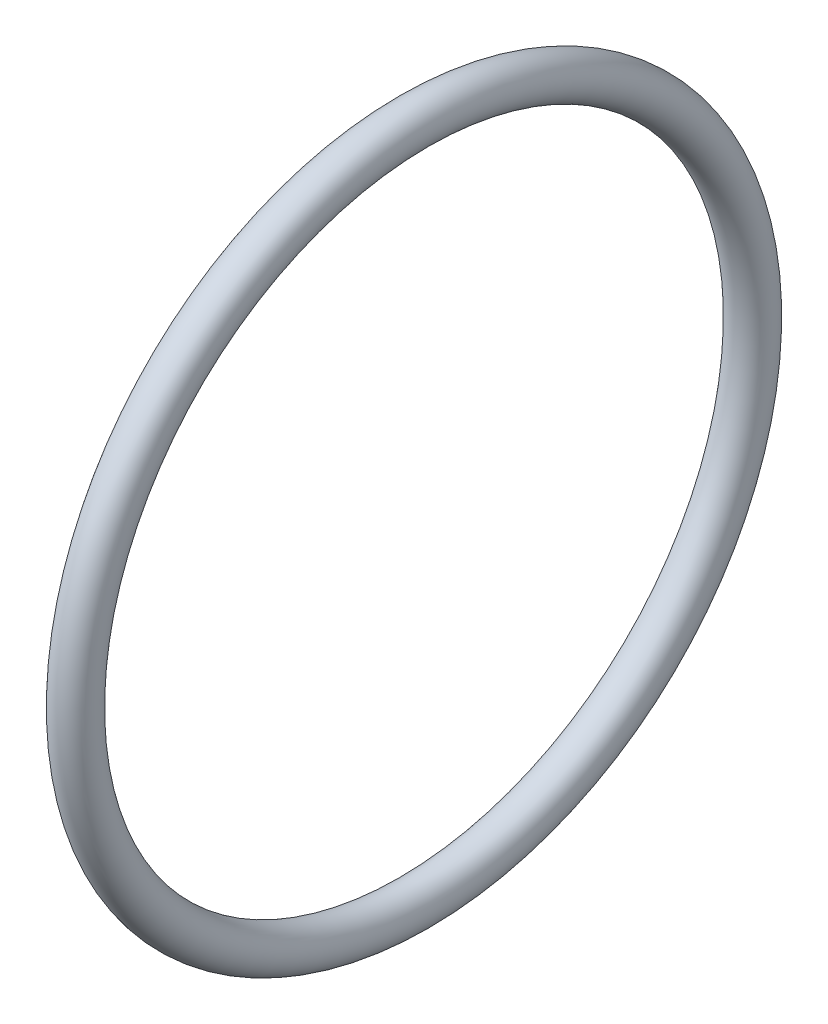
ISO-10303-21;
HEADER;
FILE_DESCRIPTION(('STEP AP214'),'2;1');
FILE_NAME('part.step','',(''),(''),'','','');
FILE_SCHEMA(('AUTOMOTIVE_DESIGN { 1 0 10303 214 1 1 1 1 }'));
ENDSEC;
DATA;
#1=APPLICATION_CONTEXT('core data for automotive mechanical design processes');
#2=APPLICATION_PROTOCOL_DEFINITION('international standard','automotive_design',2000,#1);
#3=PRODUCT_CONTEXT('',#1,'mechanical');
#4=PRODUCT('Part','Part','',(#3));
#5=PRODUCT_RELATED_PRODUCT_CATEGORY('part','',(#4));
#6=PRODUCT_DEFINITION_FORMATION('','',#4);
#7=PRODUCT_DEFINITION_CONTEXT('part definition',#1,'design');
#8=PRODUCT_DEFINITION('design','',#6,#7);
#9=PRODUCT_DEFINITION_SHAPE('','',#8);
#10=(LENGTH_UNIT() NAMED_UNIT(*) SI_UNIT(.MILLI.,.METRE.));
#11=(NAMED_UNIT(*) PLANE_ANGLE_UNIT() SI_UNIT($,.RADIAN.));
#12=(NAMED_UNIT(*) SI_UNIT($,.STERADIAN.) SOLID_ANGLE_UNIT());
#13=UNCERTAINTY_MEASURE_WITH_UNIT(LENGTH_MEASURE(1.E-05),#10,'distance_accuracy_value','');
#14=(GEOMETRIC_REPRESENTATION_CONTEXT(3) GLOBAL_UNCERTAINTY_ASSIGNED_CONTEXT((#13)) GLOBAL_UNIT_ASSIGNED_CONTEXT((#10,
#11,#12)) REPRESENTATION_CONTEXT('',''));
#15=CARTESIAN_POINT('',(0.,0.,0.));
#16=DIRECTION('',(0.,0.,1.));
#17=DIRECTION('',(1.,0.,0.));
#18=AXIS2_PLACEMENT_3D('',#15,#16,#17);
#19=CARTESIAN_POINT('',(1.63,0.,0.));
#20=DIRECTION('',(1.,0.,0.));
#21=DIRECTION('',(0.,1.,0.));
#22=AXIS2_PLACEMENT_3D('',#19,#20,#21);
#23=TOROIDAL_SURFACE('',#22,14.62,0.889999999999998);
#24=CARTESIAN_POINT('',(1.63,15.51,0.));
#25=VERTEX_POINT('',#24);
#26=VERTEX_LOOP('',#25);
#27=FACE_BOUND('',#26,.T.);
#28=ADVANCED_FACE('F13',(#27),#23,.T.);
#29=CLOSED_SHELL('',(#28));
#30=MANIFOLD_SOLID_BREP('B1',#29);
#31=ADVANCED_BREP_SHAPE_REPRESENTATION('',(#18,#30),#14);
#32=SHAPE_DEFINITION_REPRESENTATION(#9,#31);
ENDSEC;
END-ISO-10303-21;
